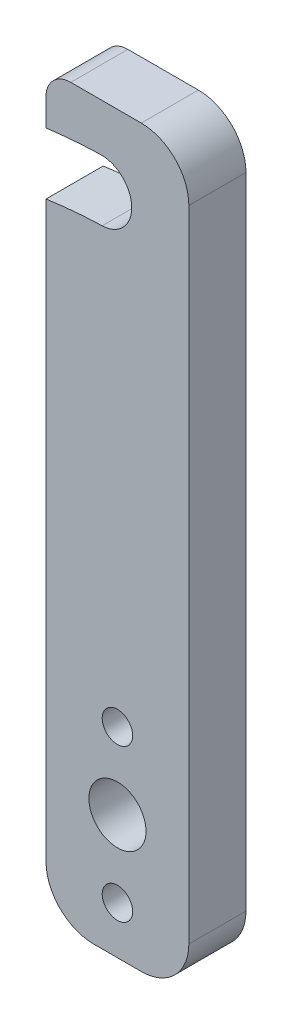
ISO-10303-21;
HEADER;
FILE_DESCRIPTION(('STEP AP214'),'2;1');
FILE_NAME('part.step','',(''),(''),'','','');
FILE_SCHEMA(('AUTOMOTIVE_DESIGN { 1 0 10303 214 1 1 1 1 }'));
ENDSEC;
DATA;
#1=APPLICATION_CONTEXT('core data for automotive mechanical design processes');
#2=APPLICATION_PROTOCOL_DEFINITION('international standard','automotive_design',2000,#1);
#3=PRODUCT_CONTEXT('',#1,'mechanical');
#4=PRODUCT('Part','Part','',(#3));
#5=PRODUCT_RELATED_PRODUCT_CATEGORY('part','',(#4));
#6=PRODUCT_DEFINITION_FORMATION('','',#4);
#7=PRODUCT_DEFINITION_CONTEXT('part definition',#1,'design');
#8=PRODUCT_DEFINITION('design','',#6,#7);
#9=PRODUCT_DEFINITION_SHAPE('','',#8);
#10=(LENGTH_UNIT() NAMED_UNIT(*) SI_UNIT(.MILLI.,.METRE.));
#11=(NAMED_UNIT(*) PLANE_ANGLE_UNIT() SI_UNIT($,.RADIAN.));
#12=(NAMED_UNIT(*) SI_UNIT($,.STERADIAN.) SOLID_ANGLE_UNIT());
#13=UNCERTAINTY_MEASURE_WITH_UNIT(LENGTH_MEASURE(1.E-05),#10,'distance_accuracy_value','');
#14=(GEOMETRIC_REPRESENTATION_CONTEXT(3) GLOBAL_UNCERTAINTY_ASSIGNED_CONTEXT((#13)) GLOBAL_UNIT_ASSIGNED_CONTEXT((#10,
#11,#12)) REPRESENTATION_CONTEXT('',''));
#15=CARTESIAN_POINT('',(0.,0.,0.));
#16=DIRECTION('',(0.,0.,1.));
#17=DIRECTION('',(1.,0.,0.));
#18=AXIS2_PLACEMENT_3D('',#15,#16,#17);
#19=CARTESIAN_POINT('',(-1.6985277243589,30.3878537259609,6.));
#20=DIRECTION('',(0.,0.,-1.));
#21=DIRECTION('',(-1.,0.,0.));
#22=AXIS2_PLACEMENT_3D('',#19,#20,#21);
#23=CYLINDRICAL_SURFACE('',#22,3.2);
#24=CARTESIAN_POINT('',(-1.6985277243589,30.3878537259609,0.));
#25=DIRECTION('',(0.,0.,1.));
#26=DIRECTION('',(1.,0.,0.));
#27=AXIS2_PLACEMENT_3D('',#24,#25,#26);
#28=CIRCLE('',#27,3.2);
#29=CARTESIAN_POINT('',(-1.60146899725267,27.189326001602,0.));
#30=VERTEX_POINT('',#29);
#31=CARTESIAN_POINT('',(-1.79558645146512,33.5863814503198,0.));
#32=VERTEX_POINT('',#31);
#33=EDGE_CURVE('E128',#30,#32,#28,.T.);
#34=ORIENTED_EDGE('',*,*,#33,.F.);
#35=DIRECTION('',(0.,0.,-1.));
#36=VECTOR('',#35,1.);
#37=CARTESIAN_POINT('',(-1.60146899725267,27.189326001602,6.));
#38=LINE('',#37,#36);
#39=CARTESIAN_POINT('',(-1.60146899725267,27.189326001602,6.));
#40=VERTEX_POINT('',#39);
#41=EDGE_CURVE('E122',#40,#30,#38,.T.);
#42=ORIENTED_EDGE('',*,*,#41,.F.);
#43=CARTESIAN_POINT('',(-1.6985277243589,30.3878537259609,6.));
#44=DIRECTION('',(0.,0.,1.));
#45=DIRECTION('',(1.,0.,0.));
#46=AXIS2_PLACEMENT_3D('',#43,#44,#45);
#47=CIRCLE('',#46,3.2);
#48=CARTESIAN_POINT('',(-1.79558645146512,33.5863814503198,6.));
#49=VERTEX_POINT('',#48);
#50=EDGE_CURVE('E125',#40,#49,#47,.T.);
#51=ORIENTED_EDGE('',*,*,#50,.T.);
#52=DIRECTION('',(0.,0.,-1.));
#53=VECTOR('',#52,1.);
#54=CARTESIAN_POINT('',(-1.79558645146512,33.5863814503198,6.));
#55=LINE('',#54,#53);
#56=EDGE_CURVE('E172',#49,#32,#55,.T.);
#57=ORIENTED_EDGE('',*,*,#56,.T.);
#58=EDGE_LOOP('',(#34,#42,#51,#57));
#59=FACE_BOUND('',#58,.T.);
#60=ADVANCED_FACE('F35',(#59),#23,.F.);
#61=CARTESIAN_POINT('',(0.,-25.5863814503198,6.));
#62=DIRECTION('',(0.,0.,-1.));
#63=DIRECTION('',(-1.,0.,0.));
#64=AXIS2_PLACEMENT_3D('',#61,#62,#63);
#65=CYLINDRICAL_SURFACE('',#64,52.8);
#66=CARTESIAN_POINT('',(0.,-25.5863814503198,0.));
#67=DIRECTION('',(0.,0.,1.));
#68=DIRECTION('',(1.,0.,0.));
#69=AXIS2_PLACEMENT_3D('',#66,#67,#68);
#70=CIRCLE('',#69,52.8);
#71=CARTESIAN_POINT('',(-7.5,26.6782337305078,0.));
#72=VERTEX_POINT('',#71);
#73=EDGE_CURVE('E177',#30,#72,#70,.T.);
#74=ORIENTED_EDGE('',*,*,#73,.T.);
#75=DIRECTION('',(0.,0.,-1.));
#76=VECTOR('',#75,1.);
#77=CARTESIAN_POINT('',(-7.5,26.6782337305078,6.));
#78=LINE('',#77,#76);
#79=CARTESIAN_POINT('',(-7.5,26.6782337305078,6.));
#80=VERTEX_POINT('',#79);
#81=EDGE_CURVE('E133',#80,#72,#78,.T.);
#82=ORIENTED_EDGE('',*,*,#81,.F.);
#83=CARTESIAN_POINT('',(0.,-25.5863814503198,6.));
#84=DIRECTION('',(0.,0.,1.));
#85=DIRECTION('',(1.,0.,0.));
#86=AXIS2_PLACEMENT_3D('',#83,#84,#85);
#87=CIRCLE('',#86,52.8);
#88=EDGE_CURVE('E137',#40,#80,#87,.T.);
#89=ORIENTED_EDGE('',*,*,#88,.F.);
#90=ORIENTED_EDGE('',*,*,#41,.T.);
#91=EDGE_LOOP('',(#74,#82,#89,#90));
#92=FACE_BOUND('',#91,.T.);
#93=ADVANCED_FACE('F138',(#92),#65,.T.);
#94=CARTESIAN_POINT('',(-7.5,0.,6.));
#95=DIRECTION('',(-1.,0.,0.));
#96=DIRECTION('',(0.,0.,1.));
#97=AXIS2_PLACEMENT_3D('',#94,#95,#96);
#98=PLANE('',#97);
#99=DIRECTION('',(0.,1.,0.));
#100=VECTOR('',#99,1.);
#101=CARTESIAN_POINT('',(-7.5,0.,0.));
#102=LINE('',#101,#100);
#103=CARTESIAN_POINT('',(-7.5,-33.5863814503198,0.));
#104=VERTEX_POINT('',#103);
#105=EDGE_CURVE('E179',#104,#72,#102,.T.);
#106=ORIENTED_EDGE('',*,*,#105,.F.);
#107=DIRECTION('',(0.,0.,-1.));
#108=VECTOR('',#107,1.);
#109=CARTESIAN_POINT('',(-7.5,-33.5863814503198,6.));
#110=LINE('',#109,#108);
#111=CARTESIAN_POINT('',(-7.5,-33.5863814503198,6.));
#112=VERTEX_POINT('',#111);
#113=EDGE_CURVE('E212',#104,#112,#110,.F.);
#114=ORIENTED_EDGE('',*,*,#113,.T.);
#115=DIRECTION('',(0.,1.,0.));
#116=VECTOR('',#115,1.);
#117=CARTESIAN_POINT('',(-7.5,0.,6.));
#118=LINE('',#117,#116);
#119=EDGE_CURVE('E142',#112,#80,#118,.T.);
#120=ORIENTED_EDGE('',*,*,#119,.T.);
#121=ORIENTED_EDGE('',*,*,#81,.T.);
#122=EDGE_LOOP('',(#106,#114,#120,#121));
#123=FACE_BOUND('',#122,.T.);
#124=ADVANCED_FACE('F256',(#123),#98,.T.);
#125=CARTESIAN_POINT('',(0.,-38.5863814503198,6.));
#126=DIRECTION('',(0.,1.,0.));
#127=DIRECTION('',(0.,0.,1.));
#128=AXIS2_PLACEMENT_3D('',#125,#126,#127);
#129=PLANE('',#128);
#130=DIRECTION('',(1.,0.,0.));
#131=VECTOR('',#130,1.);
#132=CARTESIAN_POINT('',(0.,-38.5863814503198,6.));
#133=LINE('',#132,#131);
#134=CARTESIAN_POINT('',(-2.5,-38.5863814503198,6.));
#135=VERTEX_POINT('',#134);
#136=CARTESIAN_POINT('',(2.5,-38.5863814503198,6.));
#137=VERTEX_POINT('',#136);
#138=EDGE_CURVE('E156',#135,#137,#133,.T.);
#139=ORIENTED_EDGE('',*,*,#138,.F.);
#140=DIRECTION('',(0.,0.,-1.));
#141=VECTOR('',#140,1.);
#142=CARTESIAN_POINT('',(-2.5,-38.5863814503198,0.));
#143=LINE('',#142,#141);
#144=CARTESIAN_POINT('',(-2.5,-38.5863814503198,0.));
#145=VERTEX_POINT('',#144);
#146=EDGE_CURVE('E203',#135,#145,#143,.T.);
#147=ORIENTED_EDGE('',*,*,#146,.T.);
#148=DIRECTION('',(1.,0.,0.));
#149=VECTOR('',#148,1.);
#150=CARTESIAN_POINT('',(0.,-38.5863814503198,0.));
#151=LINE('',#150,#149);
#152=CARTESIAN_POINT('',(2.5,-38.5863814503198,0.));
#153=VERTEX_POINT('',#152);
#154=EDGE_CURVE('E181',#145,#153,#151,.T.);
#155=ORIENTED_EDGE('',*,*,#154,.T.);
#156=DIRECTION('',(0.,0.,-1.));
#157=VECTOR('',#156,1.);
#158=CARTESIAN_POINT('',(2.5,-38.5863814503198,6.));
#159=LINE('',#158,#157);
#160=EDGE_CURVE('E132',#153,#137,#159,.F.);
#161=ORIENTED_EDGE('',*,*,#160,.T.);
#162=EDGE_LOOP('',(#139,#147,#155,#161));
#163=FACE_BOUND('',#162,.T.);
#164=ADVANCED_FACE('F288',(#163),#129,.F.);
#165=CARTESIAN_POINT('',(7.5,0.,6.));
#166=DIRECTION('',(-1.,0.,0.));
#167=DIRECTION('',(0.,0.,1.));
#168=AXIS2_PLACEMENT_3D('',#165,#166,#167);
#169=PLANE('',#168);
#170=DIRECTION('',(0.,1.,0.));
#171=VECTOR('',#170,1.);
#172=CARTESIAN_POINT('',(7.5,0.,6.));
#173=LINE('',#172,#171);
#174=CARTESIAN_POINT('',(7.5,-33.5863814503198,6.));
#175=VERTEX_POINT('',#174);
#176=CARTESIAN_POINT('',(7.5,33.5863814503198,6.));
#177=VERTEX_POINT('',#176);
#178=EDGE_CURVE('E160',#175,#177,#173,.T.);
#179=ORIENTED_EDGE('',*,*,#178,.F.);
#180=DIRECTION('',(0.,0.,-1.));
#181=VECTOR('',#180,1.);
#182=CARTESIAN_POINT('',(7.5,-33.5863814503198,6.));
#183=LINE('',#182,#181);
#184=CARTESIAN_POINT('',(7.5,-33.5863814503198,0.));
#185=VERTEX_POINT('',#184);
#186=EDGE_CURVE('E223',#175,#185,#183,.T.);
#187=ORIENTED_EDGE('',*,*,#186,.T.);
#188=DIRECTION('',(0.,1.,0.));
#189=VECTOR('',#188,1.);
#190=CARTESIAN_POINT('',(7.5,0.,0.));
#191=LINE('',#190,#189);
#192=CARTESIAN_POINT('',(7.5,33.5863814503198,0.));
#193=VERTEX_POINT('',#192);
#194=EDGE_CURVE('E185',#185,#193,#191,.T.);
#195=ORIENTED_EDGE('',*,*,#194,.T.);
#196=DIRECTION('',(0.,0.,-1.));
#197=VECTOR('',#196,1.);
#198=CARTESIAN_POINT('',(7.5,33.5863814503198,6.));
#199=LINE('',#198,#197);
#200=EDGE_CURVE('E221',#193,#177,#199,.F.);
#201=ORIENTED_EDGE('',*,*,#200,.T.);
#202=EDGE_LOOP('',(#179,#187,#195,#201));
#203=FACE_BOUND('',#202,.T.);
#204=ADVANCED_FACE('F280',(#203),#169,.F.);
#205=CARTESIAN_POINT('',(0.,38.5863814503198,6.));
#206=DIRECTION('',(0.,1.,0.));
#207=DIRECTION('',(0.,0.,1.));
#208=AXIS2_PLACEMENT_3D('',#205,#206,#207);
#209=PLANE('',#208);
#210=DIRECTION('',(1.,0.,0.));
#211=VECTOR('',#210,1.);
#212=CARTESIAN_POINT('',(0.,38.5863814503198,0.));
#213=LINE('',#212,#211);
#214=CARTESIAN_POINT('',(-4.9,38.5863814503198,0.));
#215=VERTEX_POINT('',#214);
#216=CARTESIAN_POINT('',(2.5,38.5863814503198,0.));
#217=VERTEX_POINT('',#216);
#218=EDGE_CURVE('E188',#215,#217,#213,.T.);
#219=ORIENTED_EDGE('',*,*,#218,.F.);
#220=DIRECTION('',(0.,0.,-1.));
#221=VECTOR('',#220,1.);
#222=CARTESIAN_POINT('',(-4.9,38.5863814503198,6.));
#223=LINE('',#222,#221);
#224=CARTESIAN_POINT('',(-4.9,38.5863814503198,6.));
#225=VERTEX_POINT('',#224);
#226=EDGE_CURVE('E43',#215,#225,#223,.F.);
#227=ORIENTED_EDGE('',*,*,#226,.T.);
#228=DIRECTION('',(1.,0.,0.));
#229=VECTOR('',#228,1.);
#230=CARTESIAN_POINT('',(0.,38.5863814503198,6.));
#231=LINE('',#230,#229);
#232=CARTESIAN_POINT('',(2.5,38.5863814503198,6.));
#233=VERTEX_POINT('',#232);
#234=EDGE_CURVE('E163',#225,#233,#231,.T.);
#235=ORIENTED_EDGE('',*,*,#234,.T.);
#236=DIRECTION('',(0.,0.,-1.));
#237=VECTOR('',#236,1.);
#238=CARTESIAN_POINT('',(2.5,38.5863814503198,0.));
#239=LINE('',#238,#237);
#240=EDGE_CURVE('E226',#233,#217,#239,.T.);
#241=ORIENTED_EDGE('',*,*,#240,.T.);
#242=EDGE_LOOP('',(#219,#227,#235,#241));
#243=FACE_BOUND('',#242,.T.);
#244=ADVANCED_FACE('F285',(#243),#209,.T.);
#245=CARTESIAN_POINT('',(-7.5,33.1366123425719,6.));
#246=VERTEX_POINT('',#245);
#247=CARTESIAN_POINT('',(-7.5,35.9863814503198,6.));
#248=VERTEX_POINT('',#247);
#249=EDGE_CURVE('E157',#246,#248,#118,.T.);
#250=ORIENTED_EDGE('',*,*,#249,.T.);
#251=DIRECTION('',(0.,0.,-1.));
#252=VECTOR('',#251,1.);
#253=CARTESIAN_POINT('',(-7.5,35.9863814503198,6.));
#254=LINE('',#253,#252);
#255=CARTESIAN_POINT('',(-7.5,35.9863814503198,0.));
#256=VERTEX_POINT('',#255);
#257=EDGE_CURVE('E229',#248,#256,#254,.T.);
#258=ORIENTED_EDGE('',*,*,#257,.T.);
#259=CARTESIAN_POINT('',(-7.5,33.1366123425719,0.));
#260=VERTEX_POINT('',#259);
#261=EDGE_CURVE('E182',#260,#256,#102,.T.);
#262=ORIENTED_EDGE('',*,*,#261,.F.);
#263=DIRECTION('',(0.,0.,-1.));
#264=VECTOR('',#263,1.);
#265=CARTESIAN_POINT('',(-7.5,33.1366123425719,6.));
#266=LINE('',#265,#264);
#267=EDGE_CURVE('E199',#246,#260,#266,.T.);
#268=ORIENTED_EDGE('',*,*,#267,.F.);
#269=EDGE_LOOP('',(#250,#258,#262,#268));
#270=FACE_BOUND('',#269,.T.);
#271=ADVANCED_FACE('F236',(#270),#98,.T.);
#272=CARTESIAN_POINT('',(0.,-17.5863814503198,6.));
#273=DIRECTION('',(0.,0.,-1.));
#274=DIRECTION('',(-1.,0.,0.));
#275=AXIS2_PLACEMENT_3D('',#272,#273,#274);
#276=CYLINDRICAL_SURFACE('',#275,1.6);
#277=CARTESIAN_POINT('',(0.,-17.5863814503198,6.));
#278=DIRECTION('',(0.,0.,1.));
#279=DIRECTION('',(1.,0.,0.));
#280=AXIS2_PLACEMENT_3D('',#277,#278,#279);
#281=CIRCLE('',#280,1.6);
#282=CARTESIAN_POINT('',(1.6,-17.5863814503198,6.));
#283=VERTEX_POINT('',#282);
#284=EDGE_CURVE('E166',#283,#283,#281,.T.);
#285=ORIENTED_EDGE('',*,*,#284,.T.);
#286=EDGE_LOOP('',(#285));
#287=FACE_BOUND('',#286,.T.);
#288=CARTESIAN_POINT('',(0.,-17.5863814503198,0.));
#289=DIRECTION('',(0.,0.,1.));
#290=DIRECTION('',(1.,0.,0.));
#291=AXIS2_PLACEMENT_3D('',#288,#289,#290);
#292=CIRCLE('',#291,1.6);
#293=CARTESIAN_POINT('',(1.6,-17.5863814503198,0.));
#294=VERTEX_POINT('',#293);
#295=EDGE_CURVE('E193',#294,#294,#292,.T.);
#296=ORIENTED_EDGE('',*,*,#295,.F.);
#297=EDGE_LOOP('',(#296));
#298=FACE_BOUND('',#297,.T.);
#299=ADVANCED_FACE('F302',(#287,#298),#276,.F.);
#300=CARTESIAN_POINT('',(0.,-25.5863814503198,6.));
#301=DIRECTION('',(0.,0.,-1.));
#302=DIRECTION('',(-1.,0.,0.));
#303=AXIS2_PLACEMENT_3D('',#300,#301,#302);
#304=CYLINDRICAL_SURFACE('',#303,59.2);
#305=CARTESIAN_POINT('',(0.,-25.5863814503198,0.));
#306=DIRECTION('',(0.,0.,1.));
#307=DIRECTION('',(1.,0.,0.));
#308=AXIS2_PLACEMENT_3D('',#305,#306,#307);
#309=CIRCLE('',#308,59.2);
#310=EDGE_CURVE('E190',#32,#260,#309,.T.);
#311=ORIENTED_EDGE('',*,*,#310,.F.);
#312=ORIENTED_EDGE('',*,*,#56,.F.);
#313=CARTESIAN_POINT('',(0.,-25.5863814503198,6.));
#314=DIRECTION('',(0.,0.,1.));
#315=DIRECTION('',(1.,0.,0.));
#316=AXIS2_PLACEMENT_3D('',#313,#314,#315);
#317=CIRCLE('',#316,59.2);
#318=EDGE_CURVE('E148',#49,#246,#317,.T.);
#319=ORIENTED_EDGE('',*,*,#318,.T.);
#320=ORIENTED_EDGE('',*,*,#267,.T.);
#321=EDGE_LOOP('',(#311,#312,#319,#320));
#322=FACE_BOUND('',#321,.T.);
#323=ADVANCED_FACE('F243',(#322),#304,.F.);
#324=CARTESIAN_POINT('',(0.,-25.5863814503198,6.));
#325=DIRECTION('',(0.,0.,-1.));
#326=DIRECTION('',(-1.,0.,0.));
#327=AXIS2_PLACEMENT_3D('',#324,#325,#326);
#328=CYLINDRICAL_SURFACE('',#327,3.);
#329=CARTESIAN_POINT('',(0.,-25.5863814503198,6.));
#330=DIRECTION('',(0.,0.,1.));
#331=DIRECTION('',(1.,0.,0.));
#332=AXIS2_PLACEMENT_3D('',#329,#330,#331);
#333=CIRCLE('',#332,3.);
#334=CARTESIAN_POINT('',(3.,-25.5863814503198,6.));
#335=VERTEX_POINT('',#334);
#336=EDGE_CURVE('E149',#335,#335,#333,.T.);
#337=ORIENTED_EDGE('',*,*,#336,.T.);
#338=EDGE_LOOP('',(#337));
#339=FACE_BOUND('',#338,.T.);
#340=CARTESIAN_POINT('',(0.,-25.5863814503198,0.));
#341=DIRECTION('',(0.,0.,1.));
#342=DIRECTION('',(1.,0.,0.));
#343=AXIS2_PLACEMENT_3D('',#340,#341,#342);
#344=CIRCLE('',#343,3.);
#345=CARTESIAN_POINT('',(3.,-25.5863814503198,0.));
#346=VERTEX_POINT('',#345);
#347=EDGE_CURVE('E173',#346,#346,#344,.T.);
#348=ORIENTED_EDGE('',*,*,#347,.F.);
#349=EDGE_LOOP('',(#348));
#350=FACE_BOUND('',#349,.T.);
#351=ADVANCED_FACE('F260',(#339,#350),#328,.F.);
#352=CARTESIAN_POINT('',(0.,-33.5863814503198,6.));
#353=DIRECTION('',(0.,0.,-1.));
#354=DIRECTION('',(-1.,0.,0.));
#355=AXIS2_PLACEMENT_3D('',#352,#353,#354);
#356=CYLINDRICAL_SURFACE('',#355,1.6);
#357=CARTESIAN_POINT('',(0.,-33.5863814503198,6.));
#358=DIRECTION('',(0.,0.,1.));
#359=DIRECTION('',(1.,0.,0.));
#360=AXIS2_PLACEMENT_3D('',#357,#358,#359);
#361=CIRCLE('',#360,1.6);
#362=CARTESIAN_POINT('',(1.6,-33.5863814503198,6.));
#363=VERTEX_POINT('',#362);
#364=EDGE_CURVE('E169',#363,#363,#361,.T.);
#365=ORIENTED_EDGE('',*,*,#364,.T.);
#366=EDGE_LOOP('',(#365));
#367=FACE_BOUND('',#366,.T.);
#368=CARTESIAN_POINT('',(0.,-33.5863814503198,0.));
#369=DIRECTION('',(0.,0.,1.));
#370=DIRECTION('',(1.,0.,0.));
#371=AXIS2_PLACEMENT_3D('',#368,#369,#370);
#372=CIRCLE('',#371,1.6);
#373=CARTESIAN_POINT('',(1.6,-33.5863814503198,0.));
#374=VERTEX_POINT('',#373);
#375=EDGE_CURVE('E152',#374,#374,#372,.T.);
#376=ORIENTED_EDGE('',*,*,#375,.F.);
#377=EDGE_LOOP('',(#376));
#378=FACE_BOUND('',#377,.T.);
#379=ADVANCED_FACE('F263',(#367,#378),#356,.F.);
#380=CARTESIAN_POINT('',(0.,0.,6.));
#381=DIRECTION('',(0.,0.,1.));
#382=DIRECTION('',(1.,0.,0.));
#383=AXIS2_PLACEMENT_3D('',#380,#381,#382);
#384=PLANE('',#383);
#385=ORIENTED_EDGE('',*,*,#336,.F.);
#386=EDGE_LOOP('',(#385));
#387=FACE_BOUND('',#386,.T.);
#388=ORIENTED_EDGE('',*,*,#234,.F.);
#389=CARTESIAN_POINT('',(-4.9,35.9863814503198,6.));
#390=DIRECTION('',(0.,0.,1.));
#391=DIRECTION('',(1.,0.,0.));
#392=AXIS2_PLACEMENT_3D('',#389,#390,#391);
#393=CIRCLE('',#392,2.6);
#394=EDGE_CURVE('E11',#225,#248,#393,.T.);
#395=ORIENTED_EDGE('',*,*,#394,.T.);
#396=ORIENTED_EDGE('',*,*,#249,.F.);
#397=ORIENTED_EDGE('',*,*,#318,.F.);
#398=ORIENTED_EDGE('',*,*,#50,.F.);
#399=ORIENTED_EDGE('',*,*,#88,.T.);
#400=ORIENTED_EDGE('',*,*,#119,.F.);
#401=CARTESIAN_POINT('',(-2.5,-33.5863814503198,6.));
#402=DIRECTION('',(0.,0.,1.));
#403=DIRECTION('',(1.,0.,0.));
#404=AXIS2_PLACEMENT_3D('',#401,#402,#403);
#405=CIRCLE('',#404,5.);
#406=EDGE_CURVE('E219',#112,#135,#405,.T.);
#407=ORIENTED_EDGE('',*,*,#406,.T.);
#408=ORIENTED_EDGE('',*,*,#138,.T.);
#409=CARTESIAN_POINT('',(2.5,-33.5863814503198,6.));
#410=DIRECTION('',(0.,0.,1.));
#411=DIRECTION('',(1.,0.,0.));
#412=AXIS2_PLACEMENT_3D('',#409,#410,#411);
#413=CIRCLE('',#412,5.);
#414=EDGE_CURVE('E217',#137,#175,#413,.T.);
#415=ORIENTED_EDGE('',*,*,#414,.T.);
#416=ORIENTED_EDGE('',*,*,#178,.T.);
#417=CARTESIAN_POINT('',(2.5,33.5863814503198,6.));
#418=DIRECTION('',(0.,0.,1.));
#419=DIRECTION('',(1.,0.,0.));
#420=AXIS2_PLACEMENT_3D('',#417,#418,#419);
#421=CIRCLE('',#420,5.);
#422=EDGE_CURVE('E214',#177,#233,#421,.T.);
#423=ORIENTED_EDGE('',*,*,#422,.T.);
#424=EDGE_LOOP('',(#388,#395,#396,#397,#398,#399,#400,#407,#408,#415,#416,#423));
#425=FACE_BOUND('',#424,.T.);
#426=ORIENTED_EDGE('',*,*,#284,.F.);
#427=EDGE_LOOP('',(#426));
#428=FACE_BOUND('',#427,.T.);
#429=ORIENTED_EDGE('',*,*,#364,.F.);
#430=EDGE_LOOP('',(#429));
#431=FACE_BOUND('',#430,.T.);
#432=ADVANCED_FACE('F144',(#387,#425,#428,#431),#384,.T.);
#433=CARTESIAN_POINT('',(0.,0.,0.));
#434=DIRECTION('',(0.,0.,1.));
#435=DIRECTION('',(1.,0.,0.));
#436=AXIS2_PLACEMENT_3D('',#433,#434,#435);
#437=PLANE('',#436);
#438=ORIENTED_EDGE('',*,*,#347,.T.);
#439=EDGE_LOOP('',(#438));
#440=FACE_BOUND('',#439,.T.);
#441=ORIENTED_EDGE('',*,*,#261,.T.);
#442=CARTESIAN_POINT('',(-4.9,35.9863814503198,0.));
#443=DIRECTION('',(0.,0.,1.));
#444=DIRECTION('',(1.,0.,0.));
#445=AXIS2_PLACEMENT_3D('',#442,#443,#444);
#446=CIRCLE('',#445,2.6);
#447=EDGE_CURVE('E57',#256,#215,#446,.F.);
#448=ORIENTED_EDGE('',*,*,#447,.T.);
#449=ORIENTED_EDGE('',*,*,#218,.T.);
#450=CARTESIAN_POINT('',(2.5,33.5863814503198,0.));
#451=DIRECTION('',(0.,0.,1.));
#452=DIRECTION('',(1.,0.,0.));
#453=AXIS2_PLACEMENT_3D('',#450,#451,#452);
#454=CIRCLE('',#453,5.);
#455=EDGE_CURVE('E206',#217,#193,#454,.F.);
#456=ORIENTED_EDGE('',*,*,#455,.T.);
#457=ORIENTED_EDGE('',*,*,#194,.F.);
#458=CARTESIAN_POINT('',(2.5,-33.5863814503198,0.));
#459=DIRECTION('',(0.,0.,1.));
#460=DIRECTION('',(1.,0.,0.));
#461=AXIS2_PLACEMENT_3D('',#458,#459,#460);
#462=CIRCLE('',#461,5.);
#463=EDGE_CURVE('E208',#185,#153,#462,.F.);
#464=ORIENTED_EDGE('',*,*,#463,.T.);
#465=ORIENTED_EDGE('',*,*,#154,.F.);
#466=CARTESIAN_POINT('',(-2.5,-33.5863814503198,0.));
#467=DIRECTION('',(0.,0.,1.));
#468=DIRECTION('',(1.,0.,0.));
#469=AXIS2_PLACEMENT_3D('',#466,#467,#468);
#470=CIRCLE('',#469,5.);
#471=EDGE_CURVE('E210',#145,#104,#470,.F.);
#472=ORIENTED_EDGE('',*,*,#471,.T.);
#473=ORIENTED_EDGE('',*,*,#105,.T.);
#474=ORIENTED_EDGE('',*,*,#73,.F.);
#475=ORIENTED_EDGE('',*,*,#33,.T.);
#476=ORIENTED_EDGE('',*,*,#310,.T.);
#477=EDGE_LOOP('',(#441,#448,#449,#456,#457,#464,#465,#472,#473,#474,#475,#476));
#478=FACE_BOUND('',#477,.T.);
#479=ORIENTED_EDGE('',*,*,#295,.T.);
#480=EDGE_LOOP('',(#479));
#481=FACE_BOUND('',#480,.T.);
#482=ORIENTED_EDGE('',*,*,#375,.T.);
#483=EDGE_LOOP('',(#482));
#484=FACE_BOUND('',#483,.T.);
#485=ADVANCED_FACE('F239',(#440,#478,#481,#484),#437,.F.);
#486=CARTESIAN_POINT('',(-2.5,-33.5863814503198,6.));
#487=DIRECTION('',(0.,0.,1.));
#488=DIRECTION('',(1.,0.,0.));
#489=AXIS2_PLACEMENT_3D('',#486,#487,#488);
#490=CYLINDRICAL_SURFACE('',#489,5.);
#491=ORIENTED_EDGE('',*,*,#406,.F.);
#492=ORIENTED_EDGE('',*,*,#113,.F.);
#493=ORIENTED_EDGE('',*,*,#471,.F.);
#494=ORIENTED_EDGE('',*,*,#146,.F.);
#495=EDGE_LOOP('',(#491,#492,#493,#494));
#496=FACE_BOUND('',#495,.T.);
#497=ADVANCED_FACE('F265',(#496),#490,.T.);
#498=CARTESIAN_POINT('',(2.5,-33.5863814503198,6.));
#499=DIRECTION('',(0.,0.,-1.));
#500=DIRECTION('',(-1.,0.,0.));
#501=AXIS2_PLACEMENT_3D('',#498,#499,#500);
#502=CYLINDRICAL_SURFACE('',#501,5.);
#503=ORIENTED_EDGE('',*,*,#414,.F.);
#504=ORIENTED_EDGE('',*,*,#160,.F.);
#505=ORIENTED_EDGE('',*,*,#463,.F.);
#506=ORIENTED_EDGE('',*,*,#186,.F.);
#507=EDGE_LOOP('',(#503,#504,#505,#506));
#508=FACE_BOUND('',#507,.T.);
#509=ADVANCED_FACE('F249',(#508),#502,.T.);
#510=CARTESIAN_POINT('',(2.5,33.5863814503198,6.));
#511=DIRECTION('',(0.,0.,1.));
#512=DIRECTION('',(1.,0.,0.));
#513=AXIS2_PLACEMENT_3D('',#510,#511,#512);
#514=CYLINDRICAL_SURFACE('',#513,5.);
#515=ORIENTED_EDGE('',*,*,#422,.F.);
#516=ORIENTED_EDGE('',*,*,#200,.F.);
#517=ORIENTED_EDGE('',*,*,#455,.F.);
#518=ORIENTED_EDGE('',*,*,#240,.F.);
#519=EDGE_LOOP('',(#515,#516,#517,#518));
#520=FACE_BOUND('',#519,.T.);
#521=ADVANCED_FACE('F245',(#520),#514,.T.);
#522=CARTESIAN_POINT('',(-4.9,35.9863814503198,6.));
#523=DIRECTION('',(0.,0.,-1.));
#524=DIRECTION('',(-1.,0.,0.));
#525=AXIS2_PLACEMENT_3D('',#522,#523,#524);
#526=CYLINDRICAL_SURFACE('',#525,2.6);
#527=ORIENTED_EDGE('',*,*,#394,.F.);
#528=ORIENTED_EDGE('',*,*,#226,.F.);
#529=ORIENTED_EDGE('',*,*,#447,.F.);
#530=ORIENTED_EDGE('',*,*,#257,.F.);
#531=EDGE_LOOP('',(#527,#528,#529,#530));
#532=FACE_BOUND('',#531,.T.);
#533=ADVANCED_FACE('F37',(#532),#526,.T.);
#534=CLOSED_SHELL('',(#60,#93,#124,#164,#204,#244,#271,#299,#323,#351,#379,#432,#485,#497,#509,
#521,#533));
#535=MANIFOLD_SOLID_BREP('B2',#534);
#536=ADVANCED_BREP_SHAPE_REPRESENTATION('',(#18,#535),#14);
#537=SHAPE_DEFINITION_REPRESENTATION(#9,#536);
ENDSEC;
END-ISO-10303-21;
